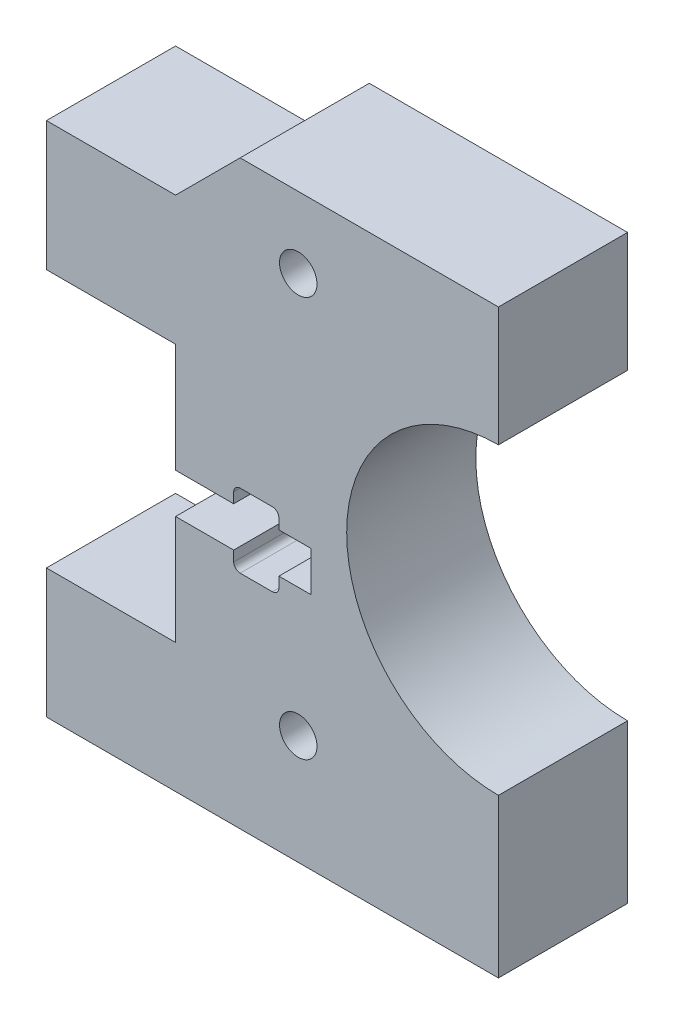
ISO-10303-21;
HEADER;
FILE_DESCRIPTION(('STEP AP214'),'2;1');
FILE_NAME('part.step','',(''),(''),'','','');
FILE_SCHEMA(('AUTOMOTIVE_DESIGN { 1 0 10303 214 1 1 1 1 }'));
ENDSEC;
DATA;
#1=APPLICATION_CONTEXT('core data for automotive mechanical design processes');
#2=APPLICATION_PROTOCOL_DEFINITION('international standard','automotive_design',2000,#1);
#3=PRODUCT_CONTEXT('',#1,'mechanical');
#4=PRODUCT('Part','Part','',(#3));
#5=PRODUCT_RELATED_PRODUCT_CATEGORY('part','',(#4));
#6=PRODUCT_DEFINITION_FORMATION('','',#4);
#7=PRODUCT_DEFINITION_CONTEXT('part definition',#1,'design');
#8=PRODUCT_DEFINITION('design','',#6,#7);
#9=PRODUCT_DEFINITION_SHAPE('','',#8);
#10=(LENGTH_UNIT() NAMED_UNIT(*) SI_UNIT(.MILLI.,.METRE.));
#11=(NAMED_UNIT(*) PLANE_ANGLE_UNIT() SI_UNIT($,.RADIAN.));
#12=(NAMED_UNIT(*) SI_UNIT($,.STERADIAN.) SOLID_ANGLE_UNIT());
#13=UNCERTAINTY_MEASURE_WITH_UNIT(LENGTH_MEASURE(1.E-05),#10,'distance_accuracy_value','');
#14=(GEOMETRIC_REPRESENTATION_CONTEXT(3) GLOBAL_UNCERTAINTY_ASSIGNED_CONTEXT((#13)) GLOBAL_UNIT_ASSIGNED_CONTEXT((#10,
#11,#12)) REPRESENTATION_CONTEXT('',''));
#15=CARTESIAN_POINT('',(0.,0.,0.));
#16=DIRECTION('',(0.,0.,1.));
#17=DIRECTION('',(1.,0.,0.));
#18=AXIS2_PLACEMENT_3D('',#15,#16,#17);
#19=CARTESIAN_POINT('',(0.,-15.,10.));
#20=DIRECTION('',(1.,0.,0.));
#21=DIRECTION('',(0.,0.,-1.));
#22=AXIS2_PLACEMENT_3D('',#19,#20,#21);
#23=PLANE('',#22);
#24=DIRECTION('',(0.,-1.,0.));
#25=VECTOR('',#24,1.);
#26=CARTESIAN_POINT('',(0.,-15.,10.));
#27=LINE('',#26,#25);
#28=CARTESIAN_POINT('',(0.,-26.55,10.));
#29=VERTEX_POINT('',#28);
#30=CARTESIAN_POINT('',(0.,-35.,10.));
#31=VERTEX_POINT('',#30);
#32=EDGE_CURVE('E286',#29,#31,#27,.T.);
#33=ORIENTED_EDGE('',*,*,#32,.F.);
#34=DIRECTION('',(0.,0.,1.));
#35=VECTOR('',#34,1.);
#36=CARTESIAN_POINT('',(0.,-26.55,0.));
#37=LINE('',#36,#35);
#38=CARTESIAN_POINT('',(0.,-26.55,0.));
#39=VERTEX_POINT('',#38);
#40=EDGE_CURVE('E341',#39,#29,#37,.T.);
#41=ORIENTED_EDGE('',*,*,#40,.F.);
#42=DIRECTION('',(0.,-1.,0.));
#43=VECTOR('',#42,1.);
#44=CARTESIAN_POINT('',(0.,-15.,0.));
#45=LINE('',#44,#43);
#46=CARTESIAN_POINT('',(0.,-35.,0.));
#47=VERTEX_POINT('',#46);
#48=EDGE_CURVE('E245',#39,#47,#45,.T.);
#49=ORIENTED_EDGE('',*,*,#48,.T.);
#50=DIRECTION('',(0.,0.,-1.));
#51=VECTOR('',#50,1.);
#52=CARTESIAN_POINT('',(0.,-35.,10.));
#53=LINE('',#52,#51);
#54=EDGE_CURVE('E269',#31,#47,#53,.T.);
#55=ORIENTED_EDGE('',*,*,#54,.F.);
#56=EDGE_LOOP('',(#33,#41,#49,#55));
#57=FACE_BOUND('',#56,.T.);
#58=ADVANCED_FACE('F33',(#57),#23,.F.);
#59=CARTESIAN_POINT('',(25.,-50.,10.));
#60=DIRECTION('',(-1.,0.,0.));
#61=DIRECTION('',(0.,0.,1.));
#62=AXIS2_PLACEMENT_3D('',#59,#60,#61);
#63=PLANE('',#62);
#64=DIRECTION('',(0.,1.,0.));
#65=VECTOR('',#64,1.);
#66=CARTESIAN_POINT('',(25.,-50.,10.));
#67=LINE('',#66,#65);
#68=CARTESIAN_POINT('',(25.,-45.,10.));
#69=VERTEX_POINT('',#68);
#70=CARTESIAN_POINT('',(25.,-32.75,10.));
#71=VERTEX_POINT('',#70);
#72=EDGE_CURVE('E263',#69,#71,#67,.T.);
#73=ORIENTED_EDGE('',*,*,#72,.F.);
#74=DIRECTION('',(0.,0.,1.));
#75=VECTOR('',#74,1.);
#76=CARTESIAN_POINT('',(25.,-45.,0.));
#77=LINE('',#76,#75);
#78=CARTESIAN_POINT('',(25.,-45.,0.));
#79=VERTEX_POINT('',#78);
#80=EDGE_CURVE('E413',#79,#69,#77,.T.);
#81=ORIENTED_EDGE('',*,*,#80,.F.);
#82=DIRECTION('',(0.,1.,0.));
#83=VECTOR('',#82,1.);
#84=CARTESIAN_POINT('',(25.,-50.,0.));
#85=LINE('',#84,#83);
#86=CARTESIAN_POINT('',(25.,-32.75,0.));
#87=VERTEX_POINT('',#86);
#88=EDGE_CURVE('E256',#79,#87,#85,.T.);
#89=ORIENTED_EDGE('',*,*,#88,.T.);
#90=DIRECTION('',(0.,0.,1.));
#91=VECTOR('',#90,1.);
#92=CARTESIAN_POINT('',(25.,-32.75,0.));
#93=LINE('',#92,#91);
#94=EDGE_CURVE('E240',#87,#71,#93,.T.);
#95=ORIENTED_EDGE('',*,*,#94,.T.);
#96=EDGE_LOOP('',(#73,#81,#89,#95));
#97=FACE_BOUND('',#96,.T.);
#98=ADVANCED_FACE('F466',(#97),#63,.F.);
#99=CARTESIAN_POINT('',(0.,0.,10.));
#100=DIRECTION('',(0.,-1.,0.));
#101=DIRECTION('',(1.,0.,0.));
#102=AXIS2_PLACEMENT_3D('',#99,#100,#101);
#103=PLANE('',#102);
#104=DIRECTION('',(-1.,0.,0.));
#105=VECTOR('',#104,1.);
#106=CARTESIAN_POINT('',(0.,0.,0.));
#107=LINE('',#106,#105);
#108=CARTESIAN_POINT('',(25.,0.,0.));
#109=VERTEX_POINT('',#108);
#110=CARTESIAN_POINT('',(4.99999999999998,0.,0.));
#111=VERTEX_POINT('',#110);
#112=EDGE_CURVE('E236',#109,#111,#107,.T.);
#113=ORIENTED_EDGE('',*,*,#112,.T.);
#114=DIRECTION('',(0.,0.,1.));
#115=VECTOR('',#114,1.);
#116=CARTESIAN_POINT('',(4.99999999999998,0.,0.));
#117=LINE('',#116,#115);
#118=CARTESIAN_POINT('',(4.99999999999998,0.,10.));
#119=VERTEX_POINT('',#118);
#120=EDGE_CURVE('E48',#111,#119,#117,.T.);
#121=ORIENTED_EDGE('',*,*,#120,.T.);
#122=DIRECTION('',(-1.,0.,0.));
#123=VECTOR('',#122,1.);
#124=CARTESIAN_POINT('',(0.,0.,10.));
#125=LINE('',#124,#123);
#126=CARTESIAN_POINT('',(25.,0.,10.));
#127=VERTEX_POINT('',#126);
#128=EDGE_CURVE('E258',#127,#119,#125,.T.);
#129=ORIENTED_EDGE('',*,*,#128,.F.);
#130=DIRECTION('',(0.,0.,-1.));
#131=VECTOR('',#130,1.);
#132=CARTESIAN_POINT('',(25.,0.,10.));
#133=LINE('',#132,#131);
#134=EDGE_CURVE('E259',#127,#109,#133,.T.);
#135=ORIENTED_EDGE('',*,*,#134,.T.);
#136=EDGE_LOOP('',(#113,#121,#129,#135));
#137=FACE_BOUND('',#136,.T.);
#138=ADVANCED_FACE('F35',(#137),#103,.F.);
#139=CARTESIAN_POINT('',(0.,-5.00000000000001,10.));
#140=DIRECTION('',(0.,-1.,0.));
#141=DIRECTION('',(1.,0.,0.));
#142=AXIS2_PLACEMENT_3D('',#139,#140,#141);
#143=PLANE('',#142);
#144=DIRECTION('',(-1.,0.,0.));
#145=VECTOR('',#144,1.);
#146=CARTESIAN_POINT('',(0.,-5.00000000000001,0.));
#147=LINE('',#146,#145);
#148=CARTESIAN_POINT('',(0.,-5.00000000000001,0.));
#149=VERTEX_POINT('',#148);
#150=CARTESIAN_POINT('',(-10.,-5.,0.));
#151=VERTEX_POINT('',#150);
#152=EDGE_CURVE('E229',#149,#151,#147,.T.);
#153=ORIENTED_EDGE('',*,*,#152,.T.);
#154=DIRECTION('',(0.,0.,-1.));
#155=VECTOR('',#154,1.);
#156=CARTESIAN_POINT('',(-10.,-5.,10.));
#157=LINE('',#156,#155);
#158=CARTESIAN_POINT('',(-10.,-5.,10.));
#159=VERTEX_POINT('',#158);
#160=EDGE_CURVE('E41',#159,#151,#157,.T.);
#161=ORIENTED_EDGE('',*,*,#160,.F.);
#162=DIRECTION('',(-1.,0.,0.));
#163=VECTOR('',#162,1.);
#164=CARTESIAN_POINT('',(0.,-5.00000000000001,10.));
#165=LINE('',#164,#163);
#166=CARTESIAN_POINT('',(0.,-5.00000000000001,10.));
#167=VERTEX_POINT('',#166);
#168=EDGE_CURVE('E231',#167,#159,#165,.T.);
#169=ORIENTED_EDGE('',*,*,#168,.F.);
#170=DIRECTION('',(0.,0.,-1.));
#171=VECTOR('',#170,1.);
#172=CARTESIAN_POINT('',(0.,-5.00000000000001,10.));
#173=LINE('',#172,#171);
#174=EDGE_CURVE('E11',#167,#149,#173,.T.);
#175=ORIENTED_EDGE('',*,*,#174,.T.);
#176=EDGE_LOOP('',(#153,#161,#169,#175));
#177=FACE_BOUND('',#176,.T.);
#178=ADVANCED_FACE('F227',(#177),#143,.F.);
#179=CARTESIAN_POINT('',(-10.,-5.,10.));
#180=DIRECTION('',(1.,0.,0.));
#181=DIRECTION('',(0.,0.,-1.));
#182=AXIS2_PLACEMENT_3D('',#179,#180,#181);
#183=PLANE('',#182);
#184=DIRECTION('',(0.,-1.,0.));
#185=VECTOR('',#184,1.);
#186=CARTESIAN_POINT('',(-10.,-5.,0.));
#187=LINE('',#186,#185);
#188=CARTESIAN_POINT('',(-10.,-15.,0.));
#189=VERTEX_POINT('',#188);
#190=EDGE_CURVE('E235',#151,#189,#187,.T.);
#191=ORIENTED_EDGE('',*,*,#190,.T.);
#192=DIRECTION('',(0.,0.,-1.));
#193=VECTOR('',#192,1.);
#194=CARTESIAN_POINT('',(-10.,-15.,10.));
#195=LINE('',#194,#193);
#196=CARTESIAN_POINT('',(-10.,-15.,10.));
#197=VERTEX_POINT('',#196);
#198=EDGE_CURVE('E275',#197,#189,#195,.T.);
#199=ORIENTED_EDGE('',*,*,#198,.F.);
#200=DIRECTION('',(0.,-1.,0.));
#201=VECTOR('',#200,1.);
#202=CARTESIAN_POINT('',(-10.,-5.,10.));
#203=LINE('',#202,#201);
#204=EDGE_CURVE('E281',#159,#197,#203,.T.);
#205=ORIENTED_EDGE('',*,*,#204,.F.);
#206=ORIENTED_EDGE('',*,*,#160,.T.);
#207=EDGE_LOOP('',(#191,#199,#205,#206));
#208=FACE_BOUND('',#207,.T.);
#209=ADVANCED_FACE('F279',(#208),#183,.F.);
#210=CARTESIAN_POINT('',(-10.,-15.,10.));
#211=DIRECTION('',(0.,1.,0.));
#212=DIRECTION('',(0.,0.,1.));
#213=AXIS2_PLACEMENT_3D('',#210,#211,#212);
#214=PLANE('',#213);
#215=DIRECTION('',(1.,0.,0.));
#216=VECTOR('',#215,1.);
#217=CARTESIAN_POINT('',(-10.,-15.,0.));
#218=LINE('',#217,#216);
#219=CARTESIAN_POINT('',(0.,-15.,0.));
#220=VERTEX_POINT('',#219);
#221=EDGE_CURVE('E238',#189,#220,#218,.T.);
#222=ORIENTED_EDGE('',*,*,#221,.T.);
#223=DIRECTION('',(0.,0.,-1.));
#224=VECTOR('',#223,1.);
#225=CARTESIAN_POINT('',(0.,-15.,10.));
#226=LINE('',#225,#224);
#227=CARTESIAN_POINT('',(0.,-15.,10.));
#228=VERTEX_POINT('',#227);
#229=EDGE_CURVE('E272',#228,#220,#226,.T.);
#230=ORIENTED_EDGE('',*,*,#229,.F.);
#231=DIRECTION('',(1.,0.,0.));
#232=VECTOR('',#231,1.);
#233=CARTESIAN_POINT('',(-10.,-15.,10.));
#234=LINE('',#233,#232);
#235=EDGE_CURVE('E284',#197,#228,#234,.T.);
#236=ORIENTED_EDGE('',*,*,#235,.F.);
#237=ORIENTED_EDGE('',*,*,#198,.T.);
#238=EDGE_LOOP('',(#222,#230,#236,#237));
#239=FACE_BOUND('',#238,.T.);
#240=ADVANCED_FACE('F548',(#239),#214,.F.);
#241=CARTESIAN_POINT('',(0.,-23.45,0.));
#242=VERTEX_POINT('',#241);
#243=EDGE_CURVE('E246',#220,#242,#45,.T.);
#244=ORIENTED_EDGE('',*,*,#243,.T.);
#245=DIRECTION('',(0.,0.,1.));
#246=VECTOR('',#245,1.);
#247=CARTESIAN_POINT('',(0.,-23.45,0.));
#248=LINE('',#247,#246);
#249=CARTESIAN_POINT('',(0.,-23.45,10.));
#250=VERTEX_POINT('',#249);
#251=EDGE_CURVE('E56',#242,#250,#248,.T.);
#252=ORIENTED_EDGE('',*,*,#251,.T.);
#253=EDGE_CURVE('E291',#228,#250,#27,.T.);
#254=ORIENTED_EDGE('',*,*,#253,.F.);
#255=ORIENTED_EDGE('',*,*,#229,.T.);
#256=EDGE_LOOP('',(#244,#252,#254,#255));
#257=FACE_BOUND('',#256,.T.);
#258=ADVANCED_FACE('F544',(#257),#23,.F.);
#259=CARTESIAN_POINT('',(-9.99999999999999,-35.,10.));
#260=DIRECTION('',(0.,-1.,0.));
#261=DIRECTION('',(0.,0.,-1.));
#262=AXIS2_PLACEMENT_3D('',#259,#260,#261);
#263=PLANE('',#262);
#264=DIRECTION('',(-1.,0.,0.));
#265=VECTOR('',#264,1.);
#266=CARTESIAN_POINT('',(-9.99999999999999,-35.,0.));
#267=LINE('',#266,#265);
#268=CARTESIAN_POINT('',(-9.99999999999999,-35.,0.));
#269=VERTEX_POINT('',#268);
#270=EDGE_CURVE('E249',#47,#269,#267,.T.);
#271=ORIENTED_EDGE('',*,*,#270,.T.);
#272=DIRECTION('',(0.,0.,-1.));
#273=VECTOR('',#272,1.);
#274=CARTESIAN_POINT('',(-9.99999999999999,-35.,10.));
#275=LINE('',#274,#273);
#276=CARTESIAN_POINT('',(-9.99999999999999,-35.,10.));
#277=VERTEX_POINT('',#276);
#278=EDGE_CURVE('E266',#277,#269,#275,.T.);
#279=ORIENTED_EDGE('',*,*,#278,.F.);
#280=DIRECTION('',(-1.,0.,0.));
#281=VECTOR('',#280,1.);
#282=CARTESIAN_POINT('',(-9.99999999999999,-35.,10.));
#283=LINE('',#282,#281);
#284=EDGE_CURVE('E294',#31,#277,#283,.T.);
#285=ORIENTED_EDGE('',*,*,#284,.F.);
#286=ORIENTED_EDGE('',*,*,#54,.T.);
#287=EDGE_LOOP('',(#271,#279,#285,#286));
#288=FACE_BOUND('',#287,.T.);
#289=ADVANCED_FACE('F480',(#288),#263,.F.);
#290=CARTESIAN_POINT('',(-9.99999999999999,-45.,10.));
#291=DIRECTION('',(1.,0.,0.));
#292=DIRECTION('',(0.,0.,-1.));
#293=AXIS2_PLACEMENT_3D('',#290,#291,#292);
#294=PLANE('',#293);
#295=DIRECTION('',(0.,-1.,0.));
#296=VECTOR('',#295,1.);
#297=CARTESIAN_POINT('',(-9.99999999999999,-45.,0.));
#298=LINE('',#297,#296);
#299=CARTESIAN_POINT('',(-9.99999999999999,-45.,0.));
#300=VERTEX_POINT('',#299);
#301=EDGE_CURVE('E251',#269,#300,#298,.T.);
#302=ORIENTED_EDGE('',*,*,#301,.T.);
#303=DIRECTION('',(0.,0.,-1.));
#304=VECTOR('',#303,1.);
#305=CARTESIAN_POINT('',(-9.99999999999999,-45.,10.));
#306=LINE('',#305,#304);
#307=CARTESIAN_POINT('',(-9.99999999999999,-45.,10.));
#308=VERTEX_POINT('',#307);
#309=EDGE_CURVE('E262',#308,#300,#306,.T.);
#310=ORIENTED_EDGE('',*,*,#309,.F.);
#311=DIRECTION('',(0.,-1.,0.));
#312=VECTOR('',#311,1.);
#313=CARTESIAN_POINT('',(-9.99999999999999,-45.,10.));
#314=LINE('',#313,#312);
#315=EDGE_CURVE('E296',#277,#308,#314,.T.);
#316=ORIENTED_EDGE('',*,*,#315,.F.);
#317=ORIENTED_EDGE('',*,*,#278,.T.);
#318=EDGE_LOOP('',(#302,#310,#316,#317));
#319=FACE_BOUND('',#318,.T.);
#320=ADVANCED_FACE('F475',(#319),#294,.F.);
#321=CARTESIAN_POINT('',(0.,-45.,10.));
#322=DIRECTION('',(0.,1.,0.));
#323=DIRECTION('',(0.,0.,1.));
#324=AXIS2_PLACEMENT_3D('',#321,#322,#323);
#325=PLANE('',#324);
#326=DIRECTION('',(1.,0.,0.));
#327=VECTOR('',#326,1.);
#328=CARTESIAN_POINT('',(0.,-45.,0.));
#329=LINE('',#328,#327);
#330=EDGE_CURVE('E253',#300,#79,#329,.T.);
#331=ORIENTED_EDGE('',*,*,#330,.T.);
#332=ORIENTED_EDGE('',*,*,#80,.T.);
#333=DIRECTION('',(1.,0.,0.));
#334=VECTOR('',#333,1.);
#335=CARTESIAN_POINT('',(0.,-45.,10.));
#336=LINE('',#335,#334);
#337=EDGE_CURVE('E298',#308,#69,#336,.T.);
#338=ORIENTED_EDGE('',*,*,#337,.F.);
#339=ORIENTED_EDGE('',*,*,#309,.T.);
#340=EDGE_LOOP('',(#331,#332,#338,#339));
#341=FACE_BOUND('',#340,.T.);
#342=ADVANCED_FACE('F462',(#341),#325,.F.);
#343=CARTESIAN_POINT('',(25.,-9.24999999999999,10.));
#344=VERTEX_POINT('',#343);
#345=EDGE_CURVE('E299',#344,#127,#67,.T.);
#346=ORIENTED_EDGE('',*,*,#345,.F.);
#347=DIRECTION('',(0.,0.,1.));
#348=VECTOR('',#347,1.);
#349=CARTESIAN_POINT('',(25.,-9.24999999999999,0.));
#350=LINE('',#349,#348);
#351=CARTESIAN_POINT('',(25.,-9.24999999999999,0.));
#352=VERTEX_POINT('',#351);
#353=EDGE_CURVE('E318',#344,#352,#350,.F.);
#354=ORIENTED_EDGE('',*,*,#353,.T.);
#355=EDGE_CURVE('E255',#352,#109,#85,.T.);
#356=ORIENTED_EDGE('',*,*,#355,.T.);
#357=ORIENTED_EDGE('',*,*,#134,.F.);
#358=EDGE_LOOP('',(#346,#354,#356,#357));
#359=FACE_BOUND('',#358,.T.);
#360=ADVANCED_FACE('F312',(#359),#63,.F.);
#361=CARTESIAN_POINT('',(0.,0.,10.));
#362=DIRECTION('',(0.,0.,1.));
#363=DIRECTION('',(1.,0.,0.));
#364=AXIS2_PLACEMENT_3D('',#361,#362,#363);
#365=PLANE('',#364);
#366=DIRECTION('',(0.707106781186546,0.707106781186549,0.));
#367=VECTOR('',#366,1.);
#368=CARTESIAN_POINT('',(0.,-5.00000000000001,10.));
#369=LINE('',#368,#367);
#370=EDGE_CURVE('E223',#167,#119,#369,.T.);
#371=ORIENTED_EDGE('',*,*,#370,.F.);
#372=ORIENTED_EDGE('',*,*,#168,.T.);
#373=ORIENTED_EDGE('',*,*,#204,.T.);
#374=ORIENTED_EDGE('',*,*,#235,.T.);
#375=ORIENTED_EDGE('',*,*,#253,.T.);
#376=DIRECTION('',(-1.,0.,0.));
#377=VECTOR('',#376,1.);
#378=CARTESIAN_POINT('',(0.,-23.45,10.));
#379=LINE('',#378,#377);
#380=CARTESIAN_POINT('',(4.5,-23.45,10.));
#381=VERTEX_POINT('',#380);
#382=EDGE_CURVE('E408',#381,#250,#379,.T.);
#383=ORIENTED_EDGE('',*,*,#382,.F.);
#384=DIRECTION('',(0.,-1.,0.));
#385=VECTOR('',#384,1.);
#386=CARTESIAN_POINT('',(4.5,-23.45,10.));
#387=LINE('',#386,#385);
#388=CARTESIAN_POINT('',(4.5,-22.65,10.));
#389=VERTEX_POINT('',#388);
#390=EDGE_CURVE('E410',#389,#381,#387,.T.);
#391=ORIENTED_EDGE('',*,*,#390,.F.);
#392=CARTESIAN_POINT('',(5.,-22.65,10.));
#393=DIRECTION('',(0.,0.,1.));
#394=DIRECTION('',(-1.,0.,0.));
#395=AXIS2_PLACEMENT_3D('',#392,#393,#394);
#396=CIRCLE('',#395,0.499999999999999);
#397=CARTESIAN_POINT('',(5.,-22.15,10.));
#398=VERTEX_POINT('',#397);
#399=EDGE_CURVE('E368',#398,#389,#396,.T.);
#400=ORIENTED_EDGE('',*,*,#399,.F.);
#401=DIRECTION('',(-1.,0.,0.));
#402=VECTOR('',#401,1.);
#403=CARTESIAN_POINT('',(5.,-22.15,10.));
#404=LINE('',#403,#402);
#405=CARTESIAN_POINT('',(7.5,-22.15,10.));
#406=VERTEX_POINT('',#405);
#407=EDGE_CURVE('E372',#406,#398,#404,.T.);
#408=ORIENTED_EDGE('',*,*,#407,.F.);
#409=CARTESIAN_POINT('',(7.5,-22.65,10.));
#410=DIRECTION('',(0.,0.,1.));
#411=DIRECTION('',(-1.,0.,0.));
#412=AXIS2_PLACEMENT_3D('',#409,#410,#411);
#413=CIRCLE('',#412,0.499999999999999);
#414=CARTESIAN_POINT('',(8.,-22.65,10.));
#415=VERTEX_POINT('',#414);
#416=EDGE_CURVE('E375',#415,#406,#413,.T.);
#417=ORIENTED_EDGE('',*,*,#416,.F.);
#418=DIRECTION('',(0.,1.,0.));
#419=VECTOR('',#418,1.);
#420=CARTESIAN_POINT('',(8.,-22.65,10.));
#421=LINE('',#420,#419);
#422=CARTESIAN_POINT('',(8.,-23.45,10.));
#423=VERTEX_POINT('',#422);
#424=EDGE_CURVE('E378',#423,#415,#421,.T.);
#425=ORIENTED_EDGE('',*,*,#424,.F.);
#426=DIRECTION('',(-1.,0.,0.));
#427=VECTOR('',#426,1.);
#428=CARTESIAN_POINT('',(8.,-23.45,10.));
#429=LINE('',#428,#427);
#430=CARTESIAN_POINT('',(10.5,-23.45,10.));
#431=VERTEX_POINT('',#430);
#432=EDGE_CURVE('E381',#431,#423,#429,.T.);
#433=ORIENTED_EDGE('',*,*,#432,.F.);
#434=DIRECTION('',(0.,1.,0.));
#435=VECTOR('',#434,1.);
#436=CARTESIAN_POINT('',(10.5,-23.45,10.));
#437=LINE('',#436,#435);
#438=CARTESIAN_POINT('',(10.5,-26.55,10.));
#439=VERTEX_POINT('',#438);
#440=EDGE_CURVE('E384',#439,#431,#437,.T.);
#441=ORIENTED_EDGE('',*,*,#440,.F.);
#442=DIRECTION('',(1.,0.,0.));
#443=VECTOR('',#442,1.);
#444=CARTESIAN_POINT('',(8.,-26.55,10.));
#445=LINE('',#444,#443);
#446=CARTESIAN_POINT('',(8.,-26.55,10.));
#447=VERTEX_POINT('',#446);
#448=EDGE_CURVE('E387',#447,#439,#445,.T.);
#449=ORIENTED_EDGE('',*,*,#448,.F.);
#450=DIRECTION('',(0.,1.,0.));
#451=VECTOR('',#450,1.);
#452=CARTESIAN_POINT('',(8.,-27.35,10.));
#453=LINE('',#452,#451);
#454=CARTESIAN_POINT('',(8.,-27.35,10.));
#455=VERTEX_POINT('',#454);
#456=EDGE_CURVE('E390',#455,#447,#453,.T.);
#457=ORIENTED_EDGE('',*,*,#456,.F.);
#458=CARTESIAN_POINT('',(7.5,-27.35,10.));
#459=DIRECTION('',(0.,0.,1.));
#460=DIRECTION('',(-1.,0.,0.));
#461=AXIS2_PLACEMENT_3D('',#458,#459,#460);
#462=CIRCLE('',#461,0.499999999999999);
#463=CARTESIAN_POINT('',(7.5,-27.85,10.));
#464=VERTEX_POINT('',#463);
#465=EDGE_CURVE('E393',#464,#455,#462,.T.);
#466=ORIENTED_EDGE('',*,*,#465,.F.);
#467=DIRECTION('',(1.,0.,0.));
#468=VECTOR('',#467,1.);
#469=CARTESIAN_POINT('',(5.,-27.85,10.));
#470=LINE('',#469,#468);
#471=CARTESIAN_POINT('',(5.,-27.85,10.));
#472=VERTEX_POINT('',#471);
#473=EDGE_CURVE('E396',#472,#464,#470,.T.);
#474=ORIENTED_EDGE('',*,*,#473,.F.);
#475=CARTESIAN_POINT('',(5.,-27.35,10.));
#476=DIRECTION('',(0.,0.,1.));
#477=DIRECTION('',(-1.,0.,0.));
#478=AXIS2_PLACEMENT_3D('',#475,#476,#477);
#479=CIRCLE('',#478,0.499999999999999);
#480=CARTESIAN_POINT('',(4.5,-27.35,10.));
#481=VERTEX_POINT('',#480);
#482=EDGE_CURVE('E399',#481,#472,#479,.T.);
#483=ORIENTED_EDGE('',*,*,#482,.F.);
#484=DIRECTION('',(0.,-1.,0.));
#485=VECTOR('',#484,1.);
#486=CARTESIAN_POINT('',(4.5,-26.55,10.));
#487=LINE('',#486,#485);
#488=CARTESIAN_POINT('',(4.5,-26.55,10.));
#489=VERTEX_POINT('',#488);
#490=EDGE_CURVE('E402',#489,#481,#487,.T.);
#491=ORIENTED_EDGE('',*,*,#490,.F.);
#492=DIRECTION('',(1.,0.,0.));
#493=VECTOR('',#492,1.);
#494=CARTESIAN_POINT('',(0.,-26.55,10.));
#495=LINE('',#494,#493);
#496=EDGE_CURVE('E405',#29,#489,#495,.T.);
#497=ORIENTED_EDGE('',*,*,#496,.F.);
#498=ORIENTED_EDGE('',*,*,#32,.T.);
#499=ORIENTED_EDGE('',*,*,#284,.T.);
#500=ORIENTED_EDGE('',*,*,#315,.T.);
#501=ORIENTED_EDGE('',*,*,#337,.T.);
#502=ORIENTED_EDGE('',*,*,#72,.T.);
#503=CARTESIAN_POINT('',(25.,-21.,10.));
#504=DIRECTION('',(0.,0.,1.));
#505=DIRECTION('',(1.,0.,0.));
#506=AXIS2_PLACEMENT_3D('',#503,#504,#505);
#507=CIRCLE('',#506,11.75);
#508=EDGE_CURVE('E309',#344,#71,#507,.T.);
#509=ORIENTED_EDGE('',*,*,#508,.F.);
#510=ORIENTED_EDGE('',*,*,#345,.T.);
#511=ORIENTED_EDGE('',*,*,#128,.T.);
#512=EDGE_LOOP('',(#371,#372,#373,#374,#375,#383,#391,#400,#408,#417,#425,#433,#441,#449,#457,
#466,#474,#483,#491,#497,#498,#499,#500,#501,#502,#509,#510,#511));
#513=FACE_BOUND('',#512,.T.);
#514=CARTESIAN_POINT('',(9.49999999999985,-36.5,10.));
#515=DIRECTION('',(0.,0.,1.));
#516=DIRECTION('',(-1.,0.,0.));
#517=AXIS2_PLACEMENT_3D('',#514,#515,#516);
#518=CIRCLE('',#517,1.45);
#519=CARTESIAN_POINT('',(8.04999999999985,-36.5,10.));
#520=VERTEX_POINT('',#519);
#521=EDGE_CURVE('E331',#520,#520,#518,.T.);
#522=ORIENTED_EDGE('',*,*,#521,.F.);
#523=EDGE_LOOP('',(#522));
#524=FACE_BOUND('',#523,.T.);
#525=CARTESIAN_POINT('',(9.49999999999984,-5.5,10.));
#526=DIRECTION('',(0.,0.,1.));
#527=DIRECTION('',(1.,0.,0.));
#528=AXIS2_PLACEMENT_3D('',#525,#526,#527);
#529=CIRCLE('',#528,1.45);
#530=CARTESIAN_POINT('',(10.9499999999998,-5.5,10.));
#531=VERTEX_POINT('',#530);
#532=EDGE_CURVE('E325',#531,#531,#529,.T.);
#533=ORIENTED_EDGE('',*,*,#532,.F.);
#534=EDGE_LOOP('',(#533));
#535=FACE_BOUND('',#534,.T.);
#536=ADVANCED_FACE('F306',(#513,#524,#535),#365,.T.);
#537=CARTESIAN_POINT('',(0.,0.,0.));
#538=DIRECTION('',(0.,0.,1.));
#539=DIRECTION('',(1.,0.,0.));
#540=AXIS2_PLACEMENT_3D('',#537,#538,#539);
#541=PLANE('',#540);
#542=CARTESIAN_POINT('',(9.49999999999985,-36.5,0.));
#543=DIRECTION('',(0.,0.,1.));
#544=DIRECTION('',(-1.,0.,0.));
#545=AXIS2_PLACEMENT_3D('',#542,#543,#544);
#546=CIRCLE('',#545,1.45);
#547=CARTESIAN_POINT('',(8.04999999999985,-36.5,0.));
#548=VERTEX_POINT('',#547);
#549=EDGE_CURVE('E328',#548,#548,#546,.T.);
#550=ORIENTED_EDGE('',*,*,#549,.T.);
#551=EDGE_LOOP('',(#550));
#552=FACE_BOUND('',#551,.T.);
#553=CARTESIAN_POINT('',(9.49999999999984,-5.5,0.));
#554=DIRECTION('',(0.,0.,1.));
#555=DIRECTION('',(1.,0.,0.));
#556=AXIS2_PLACEMENT_3D('',#553,#554,#555);
#557=CIRCLE('',#556,1.45);
#558=CARTESIAN_POINT('',(10.9499999999998,-5.5,0.));
#559=VERTEX_POINT('',#558);
#560=EDGE_CURVE('E322',#559,#559,#557,.T.);
#561=ORIENTED_EDGE('',*,*,#560,.T.);
#562=EDGE_LOOP('',(#561));
#563=FACE_BOUND('',#562,.T.);
#564=ORIENTED_EDGE('',*,*,#152,.F.);
#565=DIRECTION('',(0.707106781186546,0.707106781186549,0.));
#566=VECTOR('',#565,1.);
#567=CARTESIAN_POINT('',(0.,-5.00000000000001,0.));
#568=LINE('',#567,#566);
#569=EDGE_CURVE('E216',#149,#111,#568,.T.);
#570=ORIENTED_EDGE('',*,*,#569,.T.);
#571=ORIENTED_EDGE('',*,*,#112,.F.);
#572=ORIENTED_EDGE('',*,*,#355,.F.);
#573=CARTESIAN_POINT('',(25.,-21.,0.));
#574=DIRECTION('',(0.,0.,1.));
#575=DIRECTION('',(1.,0.,0.));
#576=AXIS2_PLACEMENT_3D('',#573,#574,#575);
#577=CIRCLE('',#576,11.75);
#578=EDGE_CURVE('E320',#352,#87,#577,.T.);
#579=ORIENTED_EDGE('',*,*,#578,.T.);
#580=ORIENTED_EDGE('',*,*,#88,.F.);
#581=ORIENTED_EDGE('',*,*,#330,.F.);
#582=ORIENTED_EDGE('',*,*,#301,.F.);
#583=ORIENTED_EDGE('',*,*,#270,.F.);
#584=ORIENTED_EDGE('',*,*,#48,.F.);
#585=DIRECTION('',(1.,0.,0.));
#586=VECTOR('',#585,1.);
#587=CARTESIAN_POINT('',(0.,-26.55,0.));
#588=LINE('',#587,#586);
#589=CARTESIAN_POINT('',(4.5,-26.55,0.));
#590=VERTEX_POINT('',#589);
#591=EDGE_CURVE('E449',#39,#590,#588,.T.);
#592=ORIENTED_EDGE('',*,*,#591,.T.);
#593=DIRECTION('',(0.,-1.,0.));
#594=VECTOR('',#593,1.);
#595=CARTESIAN_POINT('',(4.5,-26.55,0.));
#596=LINE('',#595,#594);
#597=CARTESIAN_POINT('',(4.5,-27.35,0.));
#598=VERTEX_POINT('',#597);
#599=EDGE_CURVE('E446',#590,#598,#596,.T.);
#600=ORIENTED_EDGE('',*,*,#599,.T.);
#601=CARTESIAN_POINT('',(5.,-27.35,0.));
#602=DIRECTION('',(0.,0.,1.));
#603=DIRECTION('',(-1.,0.,0.));
#604=AXIS2_PLACEMENT_3D('',#601,#602,#603);
#605=CIRCLE('',#604,0.499999999999999);
#606=CARTESIAN_POINT('',(5.,-27.85,0.));
#607=VERTEX_POINT('',#606);
#608=EDGE_CURVE('E443',#598,#607,#605,.T.);
#609=ORIENTED_EDGE('',*,*,#608,.T.);
#610=DIRECTION('',(1.,0.,0.));
#611=VECTOR('',#610,1.);
#612=CARTESIAN_POINT('',(5.,-27.85,0.));
#613=LINE('',#612,#611);
#614=CARTESIAN_POINT('',(7.5,-27.85,0.));
#615=VERTEX_POINT('',#614);
#616=EDGE_CURVE('E440',#607,#615,#613,.T.);
#617=ORIENTED_EDGE('',*,*,#616,.T.);
#618=CARTESIAN_POINT('',(7.5,-27.35,0.));
#619=DIRECTION('',(0.,0.,1.));
#620=DIRECTION('',(-1.,0.,0.));
#621=AXIS2_PLACEMENT_3D('',#618,#619,#620);
#622=CIRCLE('',#621,0.499999999999999);
#623=CARTESIAN_POINT('',(8.,-27.35,0.));
#624=VERTEX_POINT('',#623);
#625=EDGE_CURVE('E437',#615,#624,#622,.T.);
#626=ORIENTED_EDGE('',*,*,#625,.T.);
#627=DIRECTION('',(0.,1.,0.));
#628=VECTOR('',#627,1.);
#629=CARTESIAN_POINT('',(8.,-27.35,0.));
#630=LINE('',#629,#628);
#631=CARTESIAN_POINT('',(8.,-26.55,0.));
#632=VERTEX_POINT('',#631);
#633=EDGE_CURVE('E434',#624,#632,#630,.T.);
#634=ORIENTED_EDGE('',*,*,#633,.T.);
#635=DIRECTION('',(1.,0.,0.));
#636=VECTOR('',#635,1.);
#637=CARTESIAN_POINT('',(8.,-26.55,0.));
#638=LINE('',#637,#636);
#639=CARTESIAN_POINT('',(10.5,-26.55,0.));
#640=VERTEX_POINT('',#639);
#641=EDGE_CURVE('E431',#632,#640,#638,.T.);
#642=ORIENTED_EDGE('',*,*,#641,.T.);
#643=DIRECTION('',(0.,1.,0.));
#644=VECTOR('',#643,1.);
#645=CARTESIAN_POINT('',(10.5,-23.45,0.));
#646=LINE('',#645,#644);
#647=CARTESIAN_POINT('',(10.5,-23.45,0.));
#648=VERTEX_POINT('',#647);
#649=EDGE_CURVE('E428',#640,#648,#646,.T.);
#650=ORIENTED_EDGE('',*,*,#649,.T.);
#651=DIRECTION('',(-1.,0.,0.));
#652=VECTOR('',#651,1.);
#653=CARTESIAN_POINT('',(8.,-23.45,0.));
#654=LINE('',#653,#652);
#655=CARTESIAN_POINT('',(8.,-23.45,0.));
#656=VERTEX_POINT('',#655);
#657=EDGE_CURVE('E425',#648,#656,#654,.T.);
#658=ORIENTED_EDGE('',*,*,#657,.T.);
#659=DIRECTION('',(0.,1.,0.));
#660=VECTOR('',#659,1.);
#661=CARTESIAN_POINT('',(8.,-22.65,0.));
#662=LINE('',#661,#660);
#663=CARTESIAN_POINT('',(8.,-22.65,0.));
#664=VERTEX_POINT('',#663);
#665=EDGE_CURVE('E422',#656,#664,#662,.T.);
#666=ORIENTED_EDGE('',*,*,#665,.T.);
#667=CARTESIAN_POINT('',(7.5,-22.65,0.));
#668=DIRECTION('',(0.,0.,1.));
#669=DIRECTION('',(-1.,0.,0.));
#670=AXIS2_PLACEMENT_3D('',#667,#668,#669);
#671=CIRCLE('',#670,0.499999999999999);
#672=CARTESIAN_POINT('',(7.5,-22.15,0.));
#673=VERTEX_POINT('',#672);
#674=EDGE_CURVE('E419',#664,#673,#671,.T.);
#675=ORIENTED_EDGE('',*,*,#674,.T.);
#676=DIRECTION('',(-1.,0.,0.));
#677=VECTOR('',#676,1.);
#678=CARTESIAN_POINT('',(5.,-22.15,0.));
#679=LINE('',#678,#677);
#680=CARTESIAN_POINT('',(5.,-22.15,0.));
#681=VERTEX_POINT('',#680);
#682=EDGE_CURVE('E416',#673,#681,#679,.T.);
#683=ORIENTED_EDGE('',*,*,#682,.T.);
#684=CARTESIAN_POINT('',(5.,-22.65,0.));
#685=DIRECTION('',(0.,0.,1.));
#686=DIRECTION('',(-1.,0.,0.));
#687=AXIS2_PLACEMENT_3D('',#684,#685,#686);
#688=CIRCLE('',#687,0.499999999999999);
#689=CARTESIAN_POINT('',(4.5,-22.65,0.));
#690=VERTEX_POINT('',#689);
#691=EDGE_CURVE('E339',#681,#690,#688,.T.);
#692=ORIENTED_EDGE('',*,*,#691,.T.);
#693=DIRECTION('',(0.,-1.,0.));
#694=VECTOR('',#693,1.);
#695=CARTESIAN_POINT('',(4.5,-23.45,0.));
#696=LINE('',#695,#694);
#697=CARTESIAN_POINT('',(4.5,-23.45,0.));
#698=VERTEX_POINT('',#697);
#699=EDGE_CURVE('E371',#690,#698,#696,.T.);
#700=ORIENTED_EDGE('',*,*,#699,.T.);
#701=DIRECTION('',(-1.,0.,0.));
#702=VECTOR('',#701,1.);
#703=CARTESIAN_POINT('',(0.,-23.45,0.));
#704=LINE('',#703,#702);
#705=EDGE_CURVE('E452',#698,#242,#704,.T.);
#706=ORIENTED_EDGE('',*,*,#705,.T.);
#707=ORIENTED_EDGE('',*,*,#243,.F.);
#708=ORIENTED_EDGE('',*,*,#221,.F.);
#709=ORIENTED_EDGE('',*,*,#190,.F.);
#710=EDGE_LOOP('',(#564,#570,#571,#572,#579,#580,#581,#582,#583,#584,#592,#600,#609,#617,#626,
#634,#642,#650,#658,#666,#675,#683,#692,#700,#706,#707,#708,#709));
#711=FACE_BOUND('',#710,.T.);
#712=ADVANCED_FACE('F233',(#552,#563,#711),#541,.F.);
#713=CARTESIAN_POINT('',(25.,-21.,0.));
#714=DIRECTION('',(0.,0.,1.));
#715=DIRECTION('',(1.,0.,0.));
#716=AXIS2_PLACEMENT_3D('',#713,#714,#715);
#717=CYLINDRICAL_SURFACE('',#716,11.75);
#718=ORIENTED_EDGE('',*,*,#578,.F.);
#719=ORIENTED_EDGE('',*,*,#353,.F.);
#720=ORIENTED_EDGE('',*,*,#508,.T.);
#721=ORIENTED_EDGE('',*,*,#94,.F.);
#722=EDGE_LOOP('',(#718,#719,#720,#721));
#723=FACE_BOUND('',#722,.T.);
#724=ADVANCED_FACE('F469',(#723),#717,.F.);
#725=CARTESIAN_POINT('',(9.49999999999984,-5.5,0.));
#726=DIRECTION('',(0.,0.,1.));
#727=DIRECTION('',(1.,0.,0.));
#728=AXIS2_PLACEMENT_3D('',#725,#726,#727);
#729=CYLINDRICAL_SURFACE('',#728,1.45);
#730=ORIENTED_EDGE('',*,*,#560,.F.);
#731=EDGE_LOOP('',(#730));
#732=FACE_BOUND('',#731,.T.);
#733=ORIENTED_EDGE('',*,*,#532,.T.);
#734=EDGE_LOOP('',(#733));
#735=FACE_BOUND('',#734,.T.);
#736=ADVANCED_FACE('F577',(#732,#735),#729,.F.);
#737=CARTESIAN_POINT('',(9.49999999999985,-36.5,0.));
#738=DIRECTION('',(0.,0.,1.));
#739=DIRECTION('',(1.,0.,0.));
#740=AXIS2_PLACEMENT_3D('',#737,#738,#739);
#741=CYLINDRICAL_SURFACE('',#740,1.45);
#742=ORIENTED_EDGE('',*,*,#549,.F.);
#743=EDGE_LOOP('',(#742));
#744=FACE_BOUND('',#743,.T.);
#745=ORIENTED_EDGE('',*,*,#521,.T.);
#746=EDGE_LOOP('',(#745));
#747=FACE_BOUND('',#746,.T.);
#748=ADVANCED_FACE('F580',(#744,#747),#741,.F.);
#749=CARTESIAN_POINT('',(4.5,-23.45,0.));
#750=DIRECTION('',(-1.,0.,0.));
#751=DIRECTION('',(0.,0.,1.));
#752=AXIS2_PLACEMENT_3D('',#749,#750,#751);
#753=PLANE('',#752);
#754=ORIENTED_EDGE('',*,*,#390,.T.);
#755=DIRECTION('',(0.,0.,1.));
#756=VECTOR('',#755,1.);
#757=CARTESIAN_POINT('',(4.5,-23.45,0.));
#758=LINE('',#757,#756);
#759=EDGE_CURVE('E337',#698,#381,#758,.T.);
#760=ORIENTED_EDGE('',*,*,#759,.F.);
#761=ORIENTED_EDGE('',*,*,#699,.F.);
#762=DIRECTION('',(0.,0.,1.));
#763=VECTOR('',#762,1.);
#764=CARTESIAN_POINT('',(4.5,-22.65,0.));
#765=LINE('',#764,#763);
#766=EDGE_CURVE('E334',#690,#389,#765,.T.);
#767=ORIENTED_EDGE('',*,*,#766,.T.);
#768=EDGE_LOOP('',(#754,#760,#761,#767));
#769=FACE_BOUND('',#768,.T.);
#770=ADVANCED_FACE('F539',(#769),#753,.F.);
#771=CARTESIAN_POINT('',(5.,-22.65,0.));
#772=DIRECTION('',(0.,0.,1.));
#773=DIRECTION('',(1.,0.,0.));
#774=AXIS2_PLACEMENT_3D('',#771,#772,#773);
#775=CYLINDRICAL_SURFACE('',#774,0.499999999999999);
#776=ORIENTED_EDGE('',*,*,#399,.T.);
#777=ORIENTED_EDGE('',*,*,#766,.F.);
#778=ORIENTED_EDGE('',*,*,#691,.F.);
#779=DIRECTION('',(0.,0.,1.));
#780=VECTOR('',#779,1.);
#781=CARTESIAN_POINT('',(5.,-22.15,0.));
#782=LINE('',#781,#780);
#783=EDGE_CURVE('E365',#681,#398,#782,.T.);
#784=ORIENTED_EDGE('',*,*,#783,.T.);
#785=EDGE_LOOP('',(#776,#777,#778,#784));
#786=FACE_BOUND('',#785,.T.);
#787=ADVANCED_FACE('F535',(#786),#775,.F.);
#788=CARTESIAN_POINT('',(5.,-22.15,0.));
#789=DIRECTION('',(0.,1.,0.));
#790=DIRECTION('',(0.,0.,1.));
#791=AXIS2_PLACEMENT_3D('',#788,#789,#790);
#792=PLANE('',#791);
#793=ORIENTED_EDGE('',*,*,#407,.T.);
#794=ORIENTED_EDGE('',*,*,#783,.F.);
#795=ORIENTED_EDGE('',*,*,#682,.F.);
#796=DIRECTION('',(0.,0.,1.));
#797=VECTOR('',#796,1.);
#798=CARTESIAN_POINT('',(7.5,-22.15,0.));
#799=LINE('',#798,#797);
#800=EDGE_CURVE('E363',#673,#406,#799,.T.);
#801=ORIENTED_EDGE('',*,*,#800,.T.);
#802=EDGE_LOOP('',(#793,#794,#795,#801));
#803=FACE_BOUND('',#802,.T.);
#804=ADVANCED_FACE('F531',(#803),#792,.F.);
#805=CARTESIAN_POINT('',(7.5,-22.65,0.));
#806=DIRECTION('',(0.,0.,1.));
#807=DIRECTION('',(1.,0.,0.));
#808=AXIS2_PLACEMENT_3D('',#805,#806,#807);
#809=CYLINDRICAL_SURFACE('',#808,0.499999999999999);
#810=ORIENTED_EDGE('',*,*,#416,.T.);
#811=ORIENTED_EDGE('',*,*,#800,.F.);
#812=ORIENTED_EDGE('',*,*,#674,.F.);
#813=DIRECTION('',(0.,0.,1.));
#814=VECTOR('',#813,1.);
#815=CARTESIAN_POINT('',(8.,-22.65,0.));
#816=LINE('',#815,#814);
#817=EDGE_CURVE('E361',#664,#415,#816,.T.);
#818=ORIENTED_EDGE('',*,*,#817,.T.);
#819=EDGE_LOOP('',(#810,#811,#812,#818));
#820=FACE_BOUND('',#819,.T.);
#821=ADVANCED_FACE('F527',(#820),#809,.F.);
#822=CARTESIAN_POINT('',(8.,-22.65,0.));
#823=DIRECTION('',(1.,0.,0.));
#824=DIRECTION('',(0.,0.,-1.));
#825=AXIS2_PLACEMENT_3D('',#822,#823,#824);
#826=PLANE('',#825);
#827=ORIENTED_EDGE('',*,*,#424,.T.);
#828=ORIENTED_EDGE('',*,*,#817,.F.);
#829=ORIENTED_EDGE('',*,*,#665,.F.);
#830=DIRECTION('',(0.,0.,1.));
#831=VECTOR('',#830,1.);
#832=CARTESIAN_POINT('',(8.,-23.45,0.));
#833=LINE('',#832,#831);
#834=EDGE_CURVE('E359',#656,#423,#833,.T.);
#835=ORIENTED_EDGE('',*,*,#834,.T.);
#836=EDGE_LOOP('',(#827,#828,#829,#835));
#837=FACE_BOUND('',#836,.T.);
#838=ADVANCED_FACE('F523',(#837),#826,.F.);
#839=CARTESIAN_POINT('',(8.,-23.45,0.));
#840=DIRECTION('',(0.,1.,0.));
#841=DIRECTION('',(0.,0.,1.));
#842=AXIS2_PLACEMENT_3D('',#839,#840,#841);
#843=PLANE('',#842);
#844=ORIENTED_EDGE('',*,*,#432,.T.);
#845=ORIENTED_EDGE('',*,*,#834,.F.);
#846=ORIENTED_EDGE('',*,*,#657,.F.);
#847=DIRECTION('',(0.,0.,1.));
#848=VECTOR('',#847,1.);
#849=CARTESIAN_POINT('',(10.5,-23.45,0.));
#850=LINE('',#849,#848);
#851=EDGE_CURVE('E357',#648,#431,#850,.T.);
#852=ORIENTED_EDGE('',*,*,#851,.T.);
#853=EDGE_LOOP('',(#844,#845,#846,#852));
#854=FACE_BOUND('',#853,.T.);
#855=ADVANCED_FACE('F519',(#854),#843,.F.);
#856=CARTESIAN_POINT('',(10.5,-23.45,0.));
#857=DIRECTION('',(1.,0.,0.));
#858=DIRECTION('',(0.,0.,-1.));
#859=AXIS2_PLACEMENT_3D('',#856,#857,#858);
#860=PLANE('',#859);
#861=ORIENTED_EDGE('',*,*,#440,.T.);
#862=ORIENTED_EDGE('',*,*,#851,.F.);
#863=ORIENTED_EDGE('',*,*,#649,.F.);
#864=DIRECTION('',(0.,0.,1.));
#865=VECTOR('',#864,1.);
#866=CARTESIAN_POINT('',(10.5,-26.55,0.));
#867=LINE('',#866,#865);
#868=EDGE_CURVE('E355',#640,#439,#867,.T.);
#869=ORIENTED_EDGE('',*,*,#868,.T.);
#870=EDGE_LOOP('',(#861,#862,#863,#869));
#871=FACE_BOUND('',#870,.T.);
#872=ADVANCED_FACE('F515',(#871),#860,.F.);
#873=CARTESIAN_POINT('',(8.,-26.55,0.));
#874=DIRECTION('',(0.,-1.,0.));
#875=DIRECTION('',(0.,0.,-1.));
#876=AXIS2_PLACEMENT_3D('',#873,#874,#875);
#877=PLANE('',#876);
#878=ORIENTED_EDGE('',*,*,#448,.T.);
#879=ORIENTED_EDGE('',*,*,#868,.F.);
#880=ORIENTED_EDGE('',*,*,#641,.F.);
#881=DIRECTION('',(0.,0.,1.));
#882=VECTOR('',#881,1.);
#883=CARTESIAN_POINT('',(8.,-26.55,0.));
#884=LINE('',#883,#882);
#885=EDGE_CURVE('E353',#632,#447,#884,.T.);
#886=ORIENTED_EDGE('',*,*,#885,.T.);
#887=EDGE_LOOP('',(#878,#879,#880,#886));
#888=FACE_BOUND('',#887,.T.);
#889=ADVANCED_FACE('F511',(#888),#877,.F.);
#890=CARTESIAN_POINT('',(8.,-27.35,0.));
#891=DIRECTION('',(1.,0.,0.));
#892=DIRECTION('',(0.,0.,-1.));
#893=AXIS2_PLACEMENT_3D('',#890,#891,#892);
#894=PLANE('',#893);
#895=ORIENTED_EDGE('',*,*,#456,.T.);
#896=ORIENTED_EDGE('',*,*,#885,.F.);
#897=ORIENTED_EDGE('',*,*,#633,.F.);
#898=DIRECTION('',(0.,0.,1.));
#899=VECTOR('',#898,1.);
#900=CARTESIAN_POINT('',(8.,-27.35,0.));
#901=LINE('',#900,#899);
#902=EDGE_CURVE('E351',#624,#455,#901,.T.);
#903=ORIENTED_EDGE('',*,*,#902,.T.);
#904=EDGE_LOOP('',(#895,#896,#897,#903));
#905=FACE_BOUND('',#904,.T.);
#906=ADVANCED_FACE('F507',(#905),#894,.F.);
#907=CARTESIAN_POINT('',(7.5,-27.35,0.));
#908=DIRECTION('',(0.,0.,1.));
#909=DIRECTION('',(1.,0.,0.));
#910=AXIS2_PLACEMENT_3D('',#907,#908,#909);
#911=CYLINDRICAL_SURFACE('',#910,0.499999999999999);
#912=ORIENTED_EDGE('',*,*,#465,.T.);
#913=ORIENTED_EDGE('',*,*,#902,.F.);
#914=ORIENTED_EDGE('',*,*,#625,.F.);
#915=DIRECTION('',(0.,0.,1.));
#916=VECTOR('',#915,1.);
#917=CARTESIAN_POINT('',(7.5,-27.85,0.));
#918=LINE('',#917,#916);
#919=EDGE_CURVE('E349',#615,#464,#918,.T.);
#920=ORIENTED_EDGE('',*,*,#919,.T.);
#921=EDGE_LOOP('',(#912,#913,#914,#920));
#922=FACE_BOUND('',#921,.T.);
#923=ADVANCED_FACE('F503',(#922),#911,.F.);
#924=CARTESIAN_POINT('',(5.,-27.85,0.));
#925=DIRECTION('',(0.,-1.,0.));
#926=DIRECTION('',(0.,0.,-1.));
#927=AXIS2_PLACEMENT_3D('',#924,#925,#926);
#928=PLANE('',#927);
#929=ORIENTED_EDGE('',*,*,#473,.T.);
#930=ORIENTED_EDGE('',*,*,#919,.F.);
#931=ORIENTED_EDGE('',*,*,#616,.F.);
#932=DIRECTION('',(0.,0.,1.));
#933=VECTOR('',#932,1.);
#934=CARTESIAN_POINT('',(5.,-27.85,0.));
#935=LINE('',#934,#933);
#936=EDGE_CURVE('E347',#607,#472,#935,.T.);
#937=ORIENTED_EDGE('',*,*,#936,.T.);
#938=EDGE_LOOP('',(#929,#930,#931,#937));
#939=FACE_BOUND('',#938,.T.);
#940=ADVANCED_FACE('F499',(#939),#928,.F.);
#941=CARTESIAN_POINT('',(5.,-27.35,0.));
#942=DIRECTION('',(0.,0.,1.));
#943=DIRECTION('',(1.,0.,0.));
#944=AXIS2_PLACEMENT_3D('',#941,#942,#943);
#945=CYLINDRICAL_SURFACE('',#944,0.499999999999999);
#946=ORIENTED_EDGE('',*,*,#482,.T.);
#947=ORIENTED_EDGE('',*,*,#936,.F.);
#948=ORIENTED_EDGE('',*,*,#608,.F.);
#949=DIRECTION('',(0.,0.,1.));
#950=VECTOR('',#949,1.);
#951=CARTESIAN_POINT('',(4.5,-27.35,0.));
#952=LINE('',#951,#950);
#953=EDGE_CURVE('E345',#598,#481,#952,.T.);
#954=ORIENTED_EDGE('',*,*,#953,.T.);
#955=EDGE_LOOP('',(#946,#947,#948,#954));
#956=FACE_BOUND('',#955,.T.);
#957=ADVANCED_FACE('F495',(#956),#945,.F.);
#958=CARTESIAN_POINT('',(4.5,-26.55,0.));
#959=DIRECTION('',(-1.,0.,0.));
#960=DIRECTION('',(0.,0.,1.));
#961=AXIS2_PLACEMENT_3D('',#958,#959,#960);
#962=PLANE('',#961);
#963=ORIENTED_EDGE('',*,*,#490,.T.);
#964=ORIENTED_EDGE('',*,*,#953,.F.);
#965=ORIENTED_EDGE('',*,*,#599,.F.);
#966=DIRECTION('',(0.,0.,1.));
#967=VECTOR('',#966,1.);
#968=CARTESIAN_POINT('',(4.5,-26.55,0.));
#969=LINE('',#968,#967);
#970=EDGE_CURVE('E343',#590,#489,#969,.T.);
#971=ORIENTED_EDGE('',*,*,#970,.T.);
#972=EDGE_LOOP('',(#963,#964,#965,#971));
#973=FACE_BOUND('',#972,.T.);
#974=ADVANCED_FACE('F491',(#973),#962,.F.);
#975=CARTESIAN_POINT('',(0.,-26.55,0.));
#976=DIRECTION('',(0.,-1.,0.));
#977=DIRECTION('',(0.,0.,-1.));
#978=AXIS2_PLACEMENT_3D('',#975,#976,#977);
#979=PLANE('',#978);
#980=ORIENTED_EDGE('',*,*,#496,.T.);
#981=ORIENTED_EDGE('',*,*,#970,.F.);
#982=ORIENTED_EDGE('',*,*,#591,.F.);
#983=ORIENTED_EDGE('',*,*,#40,.T.);
#984=EDGE_LOOP('',(#980,#981,#982,#983));
#985=FACE_BOUND('',#984,.T.);
#986=ADVANCED_FACE('F487',(#985),#979,.F.);
#987=CARTESIAN_POINT('',(0.,-23.45,0.));
#988=DIRECTION('',(0.,1.,0.));
#989=DIRECTION('',(0.,0.,1.));
#990=AXIS2_PLACEMENT_3D('',#987,#988,#989);
#991=PLANE('',#990);
#992=ORIENTED_EDGE('',*,*,#382,.T.);
#993=ORIENTED_EDGE('',*,*,#251,.F.);
#994=ORIENTED_EDGE('',*,*,#705,.F.);
#995=ORIENTED_EDGE('',*,*,#759,.T.);
#996=EDGE_LOOP('',(#992,#993,#994,#995));
#997=FACE_BOUND('',#996,.T.);
#998=ADVANCED_FACE('F541',(#997),#991,.F.);
#999=CARTESIAN_POINT('',(0.,-5.00000000000001,0.));
#1000=DIRECTION('',(0.707106781186549,-0.707106781186546,0.));
#1001=DIRECTION('',(0.707106781186546,0.707106781186549,0.));
#1002=AXIS2_PLACEMENT_3D('',#999,#1000,#1001);
#1003=PLANE('',#1002);
#1004=ORIENTED_EDGE('',*,*,#370,.T.);
#1005=ORIENTED_EDGE('',*,*,#120,.F.);
#1006=ORIENTED_EDGE('',*,*,#569,.F.);
#1007=ORIENTED_EDGE('',*,*,#174,.F.);
#1008=EDGE_LOOP('',(#1004,#1005,#1006,#1007));
#1009=FACE_BOUND('',#1008,.T.);
#1010=ADVANCED_FACE('F217',(#1009),#1003,.F.);
#1011=CLOSED_SHELL('',(#58,#98,#138,#178,#209,#240,#258,#289,#320,#342,#360,#536,#712,#724,#736,
#748,#770,#787,#804,#821,#838,#855,#872,#889,#906,#923,#940,#957,#974,#986,#998,#1010));
#1012=MANIFOLD_SOLID_BREP('B2',#1011);
#1013=ADVANCED_BREP_SHAPE_REPRESENTATION('',(#18,#1012),#14);
#1014=SHAPE_DEFINITION_REPRESENTATION(#9,#1013);
ENDSEC;
END-ISO-10303-21;
